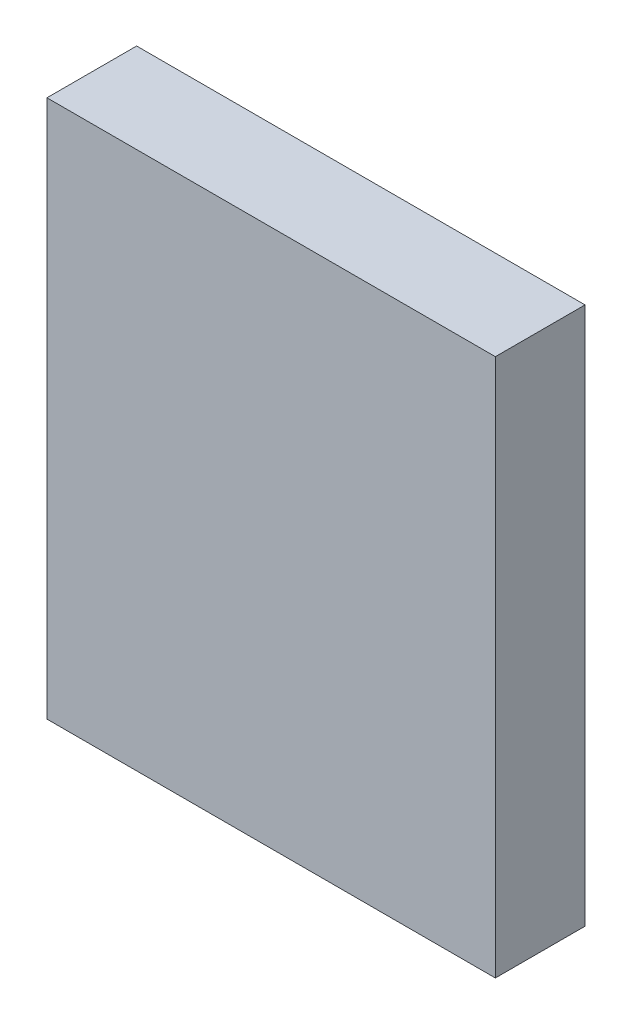
ISO-10303-21;
HEADER;
FILE_DESCRIPTION(('STEP AP214'),'2;1');
FILE_NAME('part.step','',(''),(''),'','','');
FILE_SCHEMA(('AUTOMOTIVE_DESIGN { 1 0 10303 214 1 1 1 1 }'));
ENDSEC;
DATA;
#1=APPLICATION_CONTEXT('core data for automotive mechanical design processes');
#2=APPLICATION_PROTOCOL_DEFINITION('international standard','automotive_design',2000,#1);
#3=PRODUCT_CONTEXT('',#1,'mechanical');
#4=PRODUCT('Part','Part','',(#3));
#5=PRODUCT_RELATED_PRODUCT_CATEGORY('part','',(#4));
#6=PRODUCT_DEFINITION_FORMATION('','',#4);
#7=PRODUCT_DEFINITION_CONTEXT('part definition',#1,'design');
#8=PRODUCT_DEFINITION('design','',#6,#7);
#9=PRODUCT_DEFINITION_SHAPE('','',#8);
#10=(LENGTH_UNIT() NAMED_UNIT(*) SI_UNIT(.MILLI.,.METRE.));
#11=(NAMED_UNIT(*) PLANE_ANGLE_UNIT() SI_UNIT($,.RADIAN.));
#12=(NAMED_UNIT(*) SI_UNIT($,.STERADIAN.) SOLID_ANGLE_UNIT());
#13=UNCERTAINTY_MEASURE_WITH_UNIT(LENGTH_MEASURE(1.E-05),#10,'distance_accuracy_value','');
#14=(GEOMETRIC_REPRESENTATION_CONTEXT(3) GLOBAL_UNCERTAINTY_ASSIGNED_CONTEXT((#13)) GLOBAL_UNIT_ASSIGNED_CONTEXT((#10,
#11,#12)) REPRESENTATION_CONTEXT('',''));
#15=CARTESIAN_POINT('',(0.,0.,0.));
#16=DIRECTION('',(0.,0.,1.));
#17=DIRECTION('',(1.,0.,0.));
#18=AXIS2_PLACEMENT_3D('',#15,#16,#17);
#19=CARTESIAN_POINT('',(0.,60.,10.));
#20=DIRECTION('',(0.,1.,0.));
#21=DIRECTION('',(0.,0.,1.));
#22=AXIS2_PLACEMENT_3D('',#19,#20,#21);
#23=PLANE('',#22);
#24=DIRECTION('',(1.,0.,0.));
#25=VECTOR('',#24,1.);
#26=CARTESIAN_POINT('',(0.,60.,0.));
#27=LINE('',#26,#25);
#28=CARTESIAN_POINT('',(0.,60.,0.));
#29=VERTEX_POINT('',#28);
#30=CARTESIAN_POINT('',(50.,60.,0.));
#31=VERTEX_POINT('',#30);
#32=EDGE_CURVE('E113',#29,#31,#27,.T.);
#33=ORIENTED_EDGE('',*,*,#32,.F.);
#34=DIRECTION('',(0.,0.,-1.));
#35=VECTOR('',#34,1.);
#36=CARTESIAN_POINT('',(0.,60.,10.));
#37=LINE('',#36,#35);
#38=CARTESIAN_POINT('',(0.,60.,10.));
#39=VERTEX_POINT('',#38);
#40=EDGE_CURVE('E11',#39,#29,#37,.T.);
#41=ORIENTED_EDGE('',*,*,#40,.F.);
#42=DIRECTION('',(1.,0.,0.));
#43=VECTOR('',#42,1.);
#44=CARTESIAN_POINT('',(0.,60.,10.));
#45=LINE('',#44,#43);
#46=CARTESIAN_POINT('',(50.,60.,10.));
#47=VERTEX_POINT('',#46);
#48=EDGE_CURVE('E105',#39,#47,#45,.T.);
#49=ORIENTED_EDGE('',*,*,#48,.T.);
#50=DIRECTION('',(0.,0.,-1.));
#51=VECTOR('',#50,1.);
#52=CARTESIAN_POINT('',(50.,60.,10.));
#53=LINE('',#52,#51);
#54=EDGE_CURVE('E46',#47,#31,#53,.T.);
#55=ORIENTED_EDGE('',*,*,#54,.T.);
#56=EDGE_LOOP('',(#33,#41,#49,#55));
#57=FACE_BOUND('',#56,.T.);
#58=ADVANCED_FACE('F43',(#57),#23,.T.);
#59=CARTESIAN_POINT('',(0.,0.,10.));
#60=DIRECTION('',(-1.,0.,0.));
#61=DIRECTION('',(0.,0.,1.));
#62=AXIS2_PLACEMENT_3D('',#59,#60,#61);
#63=PLANE('',#62);
#64=DIRECTION('',(0.,1.,0.));
#65=VECTOR('',#64,1.);
#66=CARTESIAN_POINT('',(0.,0.,0.));
#67=LINE('',#66,#65);
#68=CARTESIAN_POINT('',(0.,0.,0.));
#69=VERTEX_POINT('',#68);
#70=EDGE_CURVE('E108',#69,#29,#67,.T.);
#71=ORIENTED_EDGE('',*,*,#70,.F.);
#72=DIRECTION('',(0.,0.,-1.));
#73=VECTOR('',#72,1.);
#74=CARTESIAN_POINT('',(0.,0.,10.));
#75=LINE('',#74,#73);
#76=CARTESIAN_POINT('',(0.,0.,10.));
#77=VERTEX_POINT('',#76);
#78=EDGE_CURVE('E53',#77,#69,#75,.T.);
#79=ORIENTED_EDGE('',*,*,#78,.F.);
#80=DIRECTION('',(0.,1.,0.));
#81=VECTOR('',#80,1.);
#82=CARTESIAN_POINT('',(0.,0.,10.));
#83=LINE('',#82,#81);
#84=EDGE_CURVE('E92',#77,#39,#83,.T.);
#85=ORIENTED_EDGE('',*,*,#84,.T.);
#86=ORIENTED_EDGE('',*,*,#40,.T.);
#87=EDGE_LOOP('',(#71,#79,#85,#86));
#88=FACE_BOUND('',#87,.T.);
#89=ADVANCED_FACE('F129',(#88),#63,.T.);
#90=CARTESIAN_POINT('',(0.,0.,10.));
#91=DIRECTION('',(0.,1.,0.));
#92=DIRECTION('',(0.,0.,1.));
#93=AXIS2_PLACEMENT_3D('',#90,#91,#92);
#94=PLANE('',#93);
#95=DIRECTION('',(1.,0.,0.));
#96=VECTOR('',#95,1.);
#97=CARTESIAN_POINT('',(0.,0.,0.));
#98=LINE('',#97,#96);
#99=CARTESIAN_POINT('',(50.,0.,0.));
#100=VERTEX_POINT('',#99);
#101=EDGE_CURVE('E98',#69,#100,#98,.T.);
#102=ORIENTED_EDGE('',*,*,#101,.T.);
#103=DIRECTION('',(0.,0.,-1.));
#104=VECTOR('',#103,1.);
#105=CARTESIAN_POINT('',(50.,0.,10.));
#106=LINE('',#105,#104);
#107=CARTESIAN_POINT('',(50.,0.,10.));
#108=VERTEX_POINT('',#107);
#109=EDGE_CURVE('E96',#108,#100,#106,.T.);
#110=ORIENTED_EDGE('',*,*,#109,.F.);
#111=DIRECTION('',(1.,0.,0.));
#112=VECTOR('',#111,1.);
#113=CARTESIAN_POINT('',(0.,0.,10.));
#114=LINE('',#113,#112);
#115=EDGE_CURVE('E89',#77,#108,#114,.T.);
#116=ORIENTED_EDGE('',*,*,#115,.F.);
#117=ORIENTED_EDGE('',*,*,#78,.T.);
#118=EDGE_LOOP('',(#102,#110,#116,#117));
#119=FACE_BOUND('',#118,.T.);
#120=ADVANCED_FACE('F97',(#119),#94,.F.);
#121=CARTESIAN_POINT('',(50.,0.,10.));
#122=DIRECTION('',(-1.,0.,0.));
#123=DIRECTION('',(0.,0.,1.));
#124=AXIS2_PLACEMENT_3D('',#121,#122,#123);
#125=PLANE('',#124);
#126=DIRECTION('',(0.,1.,0.));
#127=VECTOR('',#126,1.);
#128=CARTESIAN_POINT('',(50.,0.,0.));
#129=LINE('',#128,#127);
#130=EDGE_CURVE('E117',#100,#31,#129,.T.);
#131=ORIENTED_EDGE('',*,*,#130,.T.);
#132=ORIENTED_EDGE('',*,*,#54,.F.);
#133=DIRECTION('',(0.,1.,0.));
#134=VECTOR('',#133,1.);
#135=CARTESIAN_POINT('',(50.,0.,10.));
#136=LINE('',#135,#134);
#137=EDGE_CURVE('E86',#108,#47,#136,.T.);
#138=ORIENTED_EDGE('',*,*,#137,.F.);
#139=ORIENTED_EDGE('',*,*,#109,.T.);
#140=EDGE_LOOP('',(#131,#132,#138,#139));
#141=FACE_BOUND('',#140,.T.);
#142=ADVANCED_FACE('F103',(#141),#125,.F.);
#143=CARTESIAN_POINT('',(0.,0.,10.));
#144=DIRECTION('',(0.,0.,1.));
#145=DIRECTION('',(1.,0.,0.));
#146=AXIS2_PLACEMENT_3D('',#143,#144,#145);
#147=PLANE('',#146);
#148=ORIENTED_EDGE('',*,*,#48,.F.);
#149=ORIENTED_EDGE('',*,*,#84,.F.);
#150=ORIENTED_EDGE('',*,*,#115,.T.);
#151=ORIENTED_EDGE('',*,*,#137,.T.);
#152=EDGE_LOOP('',(#148,#149,#150,#151));
#153=FACE_BOUND('',#152,.T.);
#154=ADVANCED_FACE('F91',(#153),#147,.T.);
#155=CARTESIAN_POINT('',(0.,0.,0.));
#156=DIRECTION('',(0.,0.,1.));
#157=DIRECTION('',(1.,0.,0.));
#158=AXIS2_PLACEMENT_3D('',#155,#156,#157);
#159=PLANE('',#158);
#160=ORIENTED_EDGE('',*,*,#32,.T.);
#161=ORIENTED_EDGE('',*,*,#130,.F.);
#162=ORIENTED_EDGE('',*,*,#101,.F.);
#163=ORIENTED_EDGE('',*,*,#70,.T.);
#164=EDGE_LOOP('',(#160,#161,#162,#163));
#165=FACE_BOUND('',#164,.T.);
#166=ADVANCED_FACE('F128',(#165),#159,.F.);
#167=CLOSED_SHELL('',(#58,#89,#120,#142,#154,#166));
#168=MANIFOLD_SOLID_BREP('B2',#167);
#169=ADVANCED_BREP_SHAPE_REPRESENTATION('',(#18,#168),#14);
#170=SHAPE_DEFINITION_REPRESENTATION(#9,#169);
ENDSEC;
END-ISO-10303-21;
